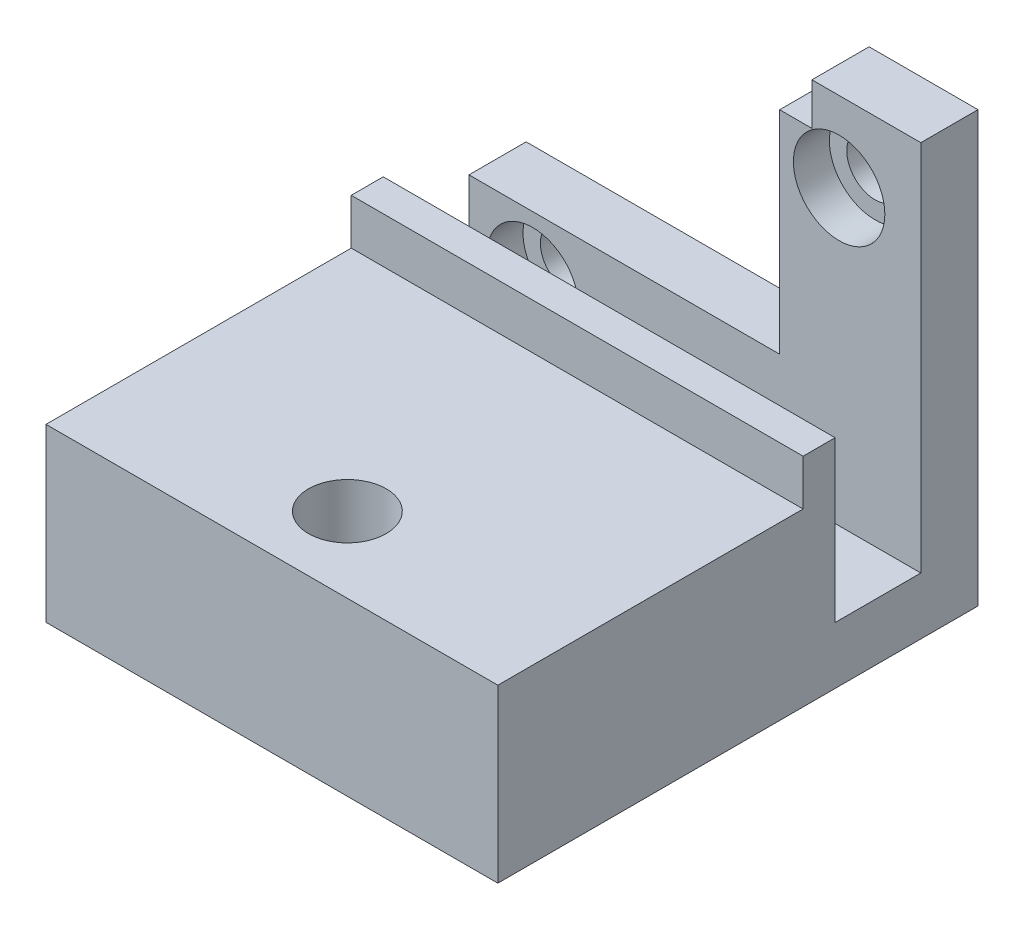
ISO-10303-21;
HEADER;
FILE_DESCRIPTION(('STEP AP214'),'2;1');
FILE_NAME('part.step','',(''),(''),'','','');
FILE_SCHEMA(('AUTOMOTIVE_DESIGN { 1 0 10303 214 1 1 1 1 }'));
ENDSEC;
DATA;
#1=APPLICATION_CONTEXT('core data for automotive mechanical design processes');
#2=APPLICATION_PROTOCOL_DEFINITION('international standard','automotive_design',2000,#1);
#3=PRODUCT_CONTEXT('',#1,'mechanical');
#4=PRODUCT('Part','Part','',(#3));
#5=PRODUCT_RELATED_PRODUCT_CATEGORY('part','',(#4));
#6=PRODUCT_DEFINITION_FORMATION('','',#4);
#7=PRODUCT_DEFINITION_CONTEXT('part definition',#1,'design');
#8=PRODUCT_DEFINITION('design','',#6,#7);
#9=PRODUCT_DEFINITION_SHAPE('','',#8);
#10=(LENGTH_UNIT() NAMED_UNIT(*) SI_UNIT(.MILLI.,.METRE.));
#11=(NAMED_UNIT(*) PLANE_ANGLE_UNIT() SI_UNIT($,.RADIAN.));
#12=(NAMED_UNIT(*) SI_UNIT($,.STERADIAN.) SOLID_ANGLE_UNIT());
#13=UNCERTAINTY_MEASURE_WITH_UNIT(LENGTH_MEASURE(1.E-05),#10,'distance_accuracy_value','');
#14=(GEOMETRIC_REPRESENTATION_CONTEXT(3) GLOBAL_UNCERTAINTY_ASSIGNED_CONTEXT((#13)) GLOBAL_UNIT_ASSIGNED_CONTEXT((#10,
#11,#12)) REPRESENTATION_CONTEXT('',''));
#15=CARTESIAN_POINT('',(0.,0.,0.));
#16=DIRECTION('',(0.,0.,1.));
#17=DIRECTION('',(1.,0.,0.));
#18=AXIS2_PLACEMENT_3D('',#15,#16,#17);
#19=CARTESIAN_POINT('',(0.,-1.69240490381664,0.));
#20=DIRECTION('',(0.,-1.,0.));
#21=DIRECTION('',(0.,0.,-1.));
#22=AXIS2_PLACEMENT_3D('',#19,#20,#21);
#23=PLANE('',#22);
#24=CARTESIAN_POINT('',(-0.311786170994832,-1.69240490381664,22.479));
#25=DIRECTION('',(0.,-1.,0.));
#26=DIRECTION('',(0.,0.,-1.));
#27=AXIS2_PLACEMENT_3D('',#24,#25,#26);
#28=CIRCLE('',#27,2.159);
#29=CARTESIAN_POINT('',(-0.311786170994832,-1.69240490381664,20.32));
#30=VERTEX_POINT('',#29);
#31=EDGE_CURVE('E147',#30,#30,#28,.T.);
#32=ORIENTED_EDGE('',*,*,#31,.T.);
#33=EDGE_LOOP('',(#32));
#34=FACE_BOUND('',#33,.T.);
#35=DIRECTION('',(1.,0.,0.));
#36=VECTOR('',#35,1.);
#37=CARTESIAN_POINT('',(-12.8607861709948,-1.69240490381664,9.7155));
#38=LINE('',#37,#36);
#39=CARTESIAN_POINT('',(-12.8607861709948,-1.69240490381664,9.7155));
#40=VERTEX_POINT('',#39);
#41=CARTESIAN_POINT('',(12.2372138290052,-1.69240490381664,9.7155));
#42=VERTEX_POINT('',#41);
#43=EDGE_CURVE('E164',#40,#42,#38,.T.);
#44=ORIENTED_EDGE('',*,*,#43,.F.);
#45=DIRECTION('',(0.,0.,1.));
#46=VECTOR('',#45,1.);
#47=CARTESIAN_POINT('',(-12.8607861709948,-1.69240490381664,26.67));
#48=LINE('',#47,#46);
#49=CARTESIAN_POINT('',(-12.8607861709948,-1.69240490381664,26.67));
#50=VERTEX_POINT('',#49);
#51=EDGE_CURVE('E268',#40,#50,#48,.T.);
#52=ORIENTED_EDGE('',*,*,#51,.T.);
#53=DIRECTION('',(1.,0.,0.));
#54=VECTOR('',#53,1.);
#55=CARTESIAN_POINT('',(-12.8607861709948,-1.69240490381664,26.67));
#56=LINE('',#55,#54);
#57=CARTESIAN_POINT('',(12.2372138290052,-1.69240490381664,26.67));
#58=VERTEX_POINT('',#57);
#59=EDGE_CURVE('E277',#50,#58,#56,.T.);
#60=ORIENTED_EDGE('',*,*,#59,.T.);
#61=DIRECTION('',(0.,0.,-1.));
#62=VECTOR('',#61,1.);
#63=CARTESIAN_POINT('',(12.2372138290052,-1.69240490381664,26.67));
#64=LINE('',#63,#62);
#65=EDGE_CURVE('E160',#58,#42,#64,.T.);
#66=ORIENTED_EDGE('',*,*,#65,.T.);
#67=EDGE_LOOP('',(#44,#52,#60,#66));
#68=FACE_BOUND('',#67,.T.);
#69=ADVANCED_FACE('F143',(#34,#68),#23,.F.);
#70=CARTESIAN_POINT('',(12.2372138290052,-8.04240490381664,26.67));
#71=DIRECTION('',(0.,1.,0.));
#72=DIRECTION('',(0.,0.,1.));
#73=AXIS2_PLACEMENT_3D('',#70,#71,#72);
#74=PLANE('',#73);
#75=DIRECTION('',(0.,0.,-1.));
#76=VECTOR('',#75,1.);
#77=CARTESIAN_POINT('',(-12.8607861709948,-8.04240490381664,26.67));
#78=LINE('',#77,#76);
#79=CARTESIAN_POINT('',(-12.8607861709948,-8.04240490381664,7.9375));
#80=VERTEX_POINT('',#79);
#81=CARTESIAN_POINT('',(-12.8607861709948,-8.04240490381664,3.175));
#82=VERTEX_POINT('',#81);
#83=EDGE_CURVE('E317',#80,#82,#78,.T.);
#84=ORIENTED_EDGE('',*,*,#83,.F.);
#85=DIRECTION('',(-1.,0.,0.));
#86=VECTOR('',#85,1.);
#87=CARTESIAN_POINT('',(-12.8607861709948,-8.04240490381664,7.9375));
#88=LINE('',#87,#86);
#89=CARTESIAN_POINT('',(12.2372138290052,-8.04240490381664,7.9375));
#90=VERTEX_POINT('',#89);
#91=EDGE_CURVE('E278',#90,#80,#88,.T.);
#92=ORIENTED_EDGE('',*,*,#91,.F.);
#93=DIRECTION('',(0.,0.,-1.));
#94=VECTOR('',#93,1.);
#95=CARTESIAN_POINT('',(12.2372138290052,-8.04240490381664,26.67));
#96=LINE('',#95,#94);
#97=CARTESIAN_POINT('',(12.2372138290052,-8.04240490381664,3.175));
#98=VERTEX_POINT('',#97);
#99=EDGE_CURVE('E314',#90,#98,#96,.T.);
#100=ORIENTED_EDGE('',*,*,#99,.T.);
#101=DIRECTION('',(-1.,0.,0.));
#102=VECTOR('',#101,1.);
#103=CARTESIAN_POINT('',(0.,-8.04240490381664,3.175));
#104=LINE('',#103,#102);
#105=EDGE_CURVE('E152',#98,#82,#104,.T.);
#106=ORIENTED_EDGE('',*,*,#105,.T.);
#107=EDGE_LOOP('',(#84,#92,#100,#106));
#108=FACE_BOUND('',#107,.T.);
#109=ADVANCED_FACE('F417',(#108),#74,.T.);
#110=CARTESIAN_POINT('',(-9.32078617099483,-4.74040490381666,3.175));
#111=DIRECTION('',(0.,0.,-1.));
#112=DIRECTION('',(-1.,0.,0.));
#113=AXIS2_PLACEMENT_3D('',#110,#111,#112);
#114=CYLINDRICAL_SURFACE('',#113,1.5748);
#115=CARTESIAN_POINT('',(-9.32078617099483,-4.74040490381666,0.));
#116=DIRECTION('',(0.,0.,1.));
#117=DIRECTION('',(1.,0.,0.));
#118=AXIS2_PLACEMENT_3D('',#115,#116,#117);
#119=CIRCLE('',#118,1.5748);
#120=CARTESIAN_POINT('',(-7.74598617099483,-4.74040490381666,0.));
#121=VERTEX_POINT('',#120);
#122=EDGE_CURVE('E316',#121,#121,#119,.T.);
#123=ORIENTED_EDGE('',*,*,#122,.F.);
#124=EDGE_LOOP('',(#123));
#125=FACE_BOUND('',#124,.T.);
#126=CARTESIAN_POINT('',(-9.32078617099483,-4.74040490381666,1.175));
#127=DIRECTION('',(0.,0.,1.));
#128=DIRECTION('',(1.,0.,0.));
#129=AXIS2_PLACEMENT_3D('',#126,#127,#128);
#130=CIRCLE('',#129,1.5748);
#131=CARTESIAN_POINT('',(-7.74598617099483,-4.74040490381666,1.175));
#132=VERTEX_POINT('',#131);
#133=EDGE_CURVE('E313',#132,#132,#130,.T.);
#134=ORIENTED_EDGE('',*,*,#133,.T.);
#135=EDGE_LOOP('',(#134));
#136=FACE_BOUND('',#135,.T.);
#137=ADVANCED_FACE('F387',(#125,#136),#114,.F.);
#138=CARTESIAN_POINT('',(7.69721382900516,8.21359509618334,3.175));
#139=DIRECTION('',(0.,0.,-1.));
#140=DIRECTION('',(-1.,0.,0.));
#141=AXIS2_PLACEMENT_3D('',#138,#139,#140);
#142=CYLINDRICAL_SURFACE('',#141,1.5748);
#143=CARTESIAN_POINT('',(7.69721382900516,8.21359509618334,0.));
#144=DIRECTION('',(0.,0.,1.));
#145=DIRECTION('',(1.,0.,0.));
#146=AXIS2_PLACEMENT_3D('',#143,#144,#145);
#147=CIRCLE('',#146,1.5748);
#148=CARTESIAN_POINT('',(9.27201382900516,8.21359509618334,0.));
#149=VERTEX_POINT('',#148);
#150=EDGE_CURVE('E340',#149,#149,#147,.T.);
#151=ORIENTED_EDGE('',*,*,#150,.F.);
#152=EDGE_LOOP('',(#151));
#153=FACE_BOUND('',#152,.T.);
#154=CARTESIAN_POINT('',(7.69721382900516,8.21359509618334,1.175));
#155=DIRECTION('',(0.,0.,1.));
#156=DIRECTION('',(1.,0.,0.));
#157=AXIS2_PLACEMENT_3D('',#154,#155,#156);
#158=CIRCLE('',#157,1.5748);
#159=CARTESIAN_POINT('',(9.27201382900516,8.21359509618334,1.175));
#160=VERTEX_POINT('',#159);
#161=EDGE_CURVE('E292',#160,#160,#158,.T.);
#162=ORIENTED_EDGE('',*,*,#161,.T.);
#163=EDGE_LOOP('',(#162));
#164=FACE_BOUND('',#163,.T.);
#165=ADVANCED_FACE('F487',(#153,#164),#142,.F.);
#166=CARTESIAN_POINT('',(0.,-1.43840490381666,3.175));
#167=DIRECTION('',(0.,-1.,0.));
#168=DIRECTION('',(1.,0.,0.));
#169=AXIS2_PLACEMENT_3D('',#166,#167,#168);
#170=PLANE('',#169);
#171=DIRECTION('',(-1.,0.,0.));
#172=VECTOR('',#171,1.);
#173=CARTESIAN_POINT('',(0.,-1.43840490381666,0.));
#174=LINE('',#173,#172);
#175=CARTESIAN_POINT('',(4.39521382900517,-1.43840490381666,0.));
#176=VERTEX_POINT('',#175);
#177=CARTESIAN_POINT('',(-12.8607861709948,-1.43840490381666,0.));
#178=VERTEX_POINT('',#177);
#179=EDGE_CURVE('E333',#176,#178,#174,.T.);
#180=ORIENTED_EDGE('',*,*,#179,.T.);
#181=DIRECTION('',(0.,0.,-1.));
#182=VECTOR('',#181,1.);
#183=CARTESIAN_POINT('',(-12.8607861709948,-1.43840490381666,3.175));
#184=LINE('',#183,#182);
#185=CARTESIAN_POINT('',(-12.8607861709948,-1.43840490381666,3.175));
#186=VERTEX_POINT('',#185);
#187=EDGE_CURVE('E12',#186,#178,#184,.T.);
#188=ORIENTED_EDGE('',*,*,#187,.F.);
#189=DIRECTION('',(-1.,0.,0.));
#190=VECTOR('',#189,1.);
#191=CARTESIAN_POINT('',(0.,-1.43840490381666,3.175));
#192=LINE('',#191,#190);
#193=CARTESIAN_POINT('',(4.39521382900517,-1.43840490381666,3.175));
#194=VERTEX_POINT('',#193);
#195=EDGE_CURVE('E324',#194,#186,#192,.T.);
#196=ORIENTED_EDGE('',*,*,#195,.F.);
#197=DIRECTION('',(0.,0.,-1.));
#198=VECTOR('',#197,1.);
#199=CARTESIAN_POINT('',(4.39521382900517,-1.43840490381666,3.175));
#200=LINE('',#199,#198);
#201=EDGE_CURVE('E358',#194,#176,#200,.T.);
#202=ORIENTED_EDGE('',*,*,#201,.T.);
#203=EDGE_LOOP('',(#180,#188,#196,#202));
#204=FACE_BOUND('',#203,.T.);
#205=ADVANCED_FACE('F415',(#204),#170,.F.);
#206=CARTESIAN_POINT('',(-12.8607861709948,0.,3.175));
#207=DIRECTION('',(1.,0.,0.));
#208=DIRECTION('',(0.,0.,-1.));
#209=AXIS2_PLACEMENT_3D('',#206,#207,#208);
#210=PLANE('',#209);
#211=DIRECTION('',(0.,-1.,0.));
#212=VECTOR('',#211,1.);
#213=CARTESIAN_POINT('',(-12.8607861709948,0.,0.));
#214=LINE('',#213,#212);
#215=CARTESIAN_POINT('',(-12.8607861709948,-11.2174049038166,0.));
#216=VERTEX_POINT('',#215);
#217=EDGE_CURVE('E328',#178,#216,#214,.T.);
#218=ORIENTED_EDGE('',*,*,#217,.T.);
#219=DIRECTION('',(0.,0.,-1.));
#220=VECTOR('',#219,1.);
#221=CARTESIAN_POINT('',(-12.8607861709948,-11.2174049038166,26.67));
#222=LINE('',#221,#220);
#223=CARTESIAN_POINT('',(-12.8607861709948,-11.2174049038166,26.67));
#224=VERTEX_POINT('',#223);
#225=EDGE_CURVE('E319',#224,#216,#222,.T.);
#226=ORIENTED_EDGE('',*,*,#225,.F.);
#227=DIRECTION('',(0.,1.,0.));
#228=VECTOR('',#227,1.);
#229=CARTESIAN_POINT('',(-12.8607861709948,-8.04240490381664,26.67));
#230=LINE('',#229,#228);
#231=EDGE_CURVE('E308',#224,#50,#230,.T.);
#232=ORIENTED_EDGE('',*,*,#231,.T.);
#233=ORIENTED_EDGE('',*,*,#51,.F.);
#234=DIRECTION('',(0.,-1.,0.));
#235=VECTOR('',#234,1.);
#236=CARTESIAN_POINT('',(-12.8607861709948,0.847595096183364,9.7155));
#237=LINE('',#236,#235);
#238=CARTESIAN_POINT('',(-12.8607861709948,0.847595096183364,9.7155));
#239=VERTEX_POINT('',#238);
#240=EDGE_CURVE('E249',#239,#40,#237,.T.);
#241=ORIENTED_EDGE('',*,*,#240,.F.);
#242=DIRECTION('',(0.,0.,1.));
#243=VECTOR('',#242,1.);
#244=CARTESIAN_POINT('',(-12.8607861709948,0.847595096183364,7.9375));
#245=LINE('',#244,#243);
#246=CARTESIAN_POINT('',(-12.8607861709948,0.847595096183364,7.9375));
#247=VERTEX_POINT('',#246);
#248=EDGE_CURVE('E256',#247,#239,#245,.T.);
#249=ORIENTED_EDGE('',*,*,#248,.F.);
#250=DIRECTION('',(0.,-1.,0.));
#251=VECTOR('',#250,1.);
#252=CARTESIAN_POINT('',(-12.8607861709948,-1.69240490381664,7.9375));
#253=LINE('',#252,#251);
#254=EDGE_CURVE('E281',#247,#80,#253,.T.);
#255=ORIENTED_EDGE('',*,*,#254,.T.);
#256=ORIENTED_EDGE('',*,*,#83,.T.);
#257=DIRECTION('',(0.,-1.,0.));
#258=VECTOR('',#257,1.);
#259=CARTESIAN_POINT('',(-12.8607861709948,0.,3.175));
#260=LINE('',#259,#258);
#261=EDGE_CURVE('E327',#186,#82,#260,.T.);
#262=ORIENTED_EDGE('',*,*,#261,.F.);
#263=ORIENTED_EDGE('',*,*,#187,.T.);
#264=EDGE_LOOP('',(#218,#226,#232,#233,#241,#249,#255,#256,#262,#263));
#265=FACE_BOUND('',#264,.T.);
#266=ADVANCED_FACE('F266',(#265),#210,.F.);
#267=CARTESIAN_POINT('',(0.,0.,3.175));
#268=DIRECTION('',(0.,0.,1.));
#269=DIRECTION('',(1.,0.,0.));
#270=AXIS2_PLACEMENT_3D('',#267,#268,#269);
#271=PLANE('',#270);
#272=CARTESIAN_POINT('',(7.69721382900516,8.21359509618334,3.175));
#273=DIRECTION('',(0.,0.,1.));
#274=DIRECTION('',(1.,0.,0.));
#275=AXIS2_PLACEMENT_3D('',#272,#273,#274);
#276=CIRCLE('',#275,2.54);
#277=CARTESIAN_POINT('',(10.2372138290052,8.21359509618334,3.175));
#278=VERTEX_POINT('',#277);
#279=EDGE_CURVE('E293',#278,#278,#276,.T.);
#280=ORIENTED_EDGE('',*,*,#279,.F.);
#281=EDGE_LOOP('',(#280));
#282=FACE_BOUND('',#281,.T.);
#283=CARTESIAN_POINT('',(-9.32078617099483,-4.74040490381666,3.175));
#284=DIRECTION('',(0.,0.,1.));
#285=DIRECTION('',(1.,0.,0.));
#286=AXIS2_PLACEMENT_3D('',#283,#284,#285);
#287=CIRCLE('',#286,2.54);
#288=CARTESIAN_POINT('',(-6.78078617099483,-4.74040490381666,3.175));
#289=VERTEX_POINT('',#288);
#290=EDGE_CURVE('E288',#289,#289,#287,.T.);
#291=ORIENTED_EDGE('',*,*,#290,.F.);
#292=EDGE_LOOP('',(#291));
#293=FACE_BOUND('',#292,.T.);
#294=ORIENTED_EDGE('',*,*,#195,.T.);
#295=ORIENTED_EDGE('',*,*,#261,.T.);
#296=ORIENTED_EDGE('',*,*,#105,.F.);
#297=DIRECTION('',(0.,1.,0.));
#298=VECTOR('',#297,1.);
#299=CARTESIAN_POINT('',(12.2372138290052,-8.04240490381664,3.175));
#300=LINE('',#299,#298);
#301=CARTESIAN_POINT('',(12.2372138290052,12.6585950961833,3.175));
#302=VERTEX_POINT('',#301);
#303=EDGE_CURVE('E344',#98,#302,#300,.T.);
#304=ORIENTED_EDGE('',*,*,#303,.T.);
#305=DIRECTION('',(-1.,0.,0.));
#306=VECTOR('',#305,1.);
#307=CARTESIAN_POINT('',(12.2372138290052,12.6585950961833,3.175));
#308=LINE('',#307,#306);
#309=CARTESIAN_POINT('',(6.18817038186677,12.6585950961833,3.175));
#310=VERTEX_POINT('',#309);
#311=EDGE_CURVE('E346',#302,#310,#308,.T.);
#312=ORIENTED_EDGE('',*,*,#311,.T.);
#313=DIRECTION('',(0.,1.,0.));
#314=VECTOR('',#313,1.);
#315=CARTESIAN_POINT('',(6.18817038186677,10.3218119533511,3.175));
#316=LINE('',#315,#314);
#317=CARTESIAN_POINT('',(6.18817038186677,10.3218119533511,3.175));
#318=VERTEX_POINT('',#317);
#319=EDGE_CURVE('E349',#318,#310,#316,.T.);
#320=ORIENTED_EDGE('',*,*,#319,.F.);
#321=DIRECTION('',(1.,0.,0.));
#322=VECTOR('',#321,1.);
#323=CARTESIAN_POINT('',(4.39521382900517,10.3218119533511,3.175));
#324=LINE('',#323,#322);
#325=CARTESIAN_POINT('',(4.39521382900517,10.3218119533511,3.175));
#326=VERTEX_POINT('',#325);
#327=EDGE_CURVE('E352',#326,#318,#324,.T.);
#328=ORIENTED_EDGE('',*,*,#327,.F.);
#329=DIRECTION('',(0.,-1.,0.));
#330=VECTOR('',#329,1.);
#331=CARTESIAN_POINT('',(4.39521382900517,10.3218119533511,3.175));
#332=LINE('',#331,#330);
#333=EDGE_CURVE('E355',#326,#194,#332,.T.);
#334=ORIENTED_EDGE('',*,*,#333,.T.);
#335=EDGE_LOOP('',(#294,#295,#296,#304,#312,#320,#328,#334));
#336=FACE_BOUND('',#335,.T.);
#337=ADVANCED_FACE('F403',(#282,#293,#336),#271,.T.);
#338=CARTESIAN_POINT('',(0.,0.,0.));
#339=DIRECTION('',(0.,0.,1.));
#340=DIRECTION('',(1.,0.,0.));
#341=AXIS2_PLACEMENT_3D('',#338,#339,#340);
#342=PLANE('',#341);
#343=ORIENTED_EDGE('',*,*,#179,.F.);
#344=DIRECTION('',(0.,-1.,0.));
#345=VECTOR('',#344,1.);
#346=CARTESIAN_POINT('',(4.39521382900517,7.82738812093123,0.));
#347=LINE('',#346,#345);
#348=CARTESIAN_POINT('',(4.39521382900517,10.3218119533511,0.));
#349=VERTEX_POINT('',#348);
#350=EDGE_CURVE('E347',#349,#176,#347,.T.);
#351=ORIENTED_EDGE('',*,*,#350,.F.);
#352=DIRECTION('',(1.,0.,0.));
#353=VECTOR('',#352,1.);
#354=CARTESIAN_POINT('',(4.39521382900517,10.3218119533511,0.));
#355=LINE('',#354,#353);
#356=CARTESIAN_POINT('',(6.18817038186677,10.3218119533511,0.));
#357=VERTEX_POINT('',#356);
#358=EDGE_CURVE('E367',#349,#357,#355,.T.);
#359=ORIENTED_EDGE('',*,*,#358,.T.);
#360=DIRECTION('',(0.,1.,0.));
#361=VECTOR('',#360,1.);
#362=CARTESIAN_POINT('',(6.18817038186677,10.3218119533511,0.));
#363=LINE('',#362,#361);
#364=CARTESIAN_POINT('',(6.18817038186677,12.6585950961833,0.));
#365=VERTEX_POINT('',#364);
#366=EDGE_CURVE('E364',#357,#365,#363,.T.);
#367=ORIENTED_EDGE('',*,*,#366,.T.);
#368=DIRECTION('',(-1.,0.,0.));
#369=VECTOR('',#368,1.);
#370=CARTESIAN_POINT('',(7.69721382900516,12.6585950961833,0.));
#371=LINE('',#370,#369);
#372=CARTESIAN_POINT('',(12.2372138290052,12.6585950961833,0.));
#373=VERTEX_POINT('',#372);
#374=EDGE_CURVE('E361',#373,#365,#371,.T.);
#375=ORIENTED_EDGE('',*,*,#374,.F.);
#376=DIRECTION('',(0.,1.,0.));
#377=VECTOR('',#376,1.);
#378=CARTESIAN_POINT('',(12.2372138290052,-8.04240490381664,0.));
#379=LINE('',#378,#377);
#380=CARTESIAN_POINT('',(12.2372138290052,-11.2174049038166,0.));
#381=VERTEX_POINT('',#380);
#382=EDGE_CURVE('E343',#381,#373,#379,.T.);
#383=ORIENTED_EDGE('',*,*,#382,.F.);
#384=DIRECTION('',(-1.,0.,0.));
#385=VECTOR('',#384,1.);
#386=CARTESIAN_POINT('',(12.2372138290052,-11.2174049038166,0.));
#387=LINE('',#386,#385);
#388=EDGE_CURVE('E305',#381,#216,#387,.T.);
#389=ORIENTED_EDGE('',*,*,#388,.T.);
#390=ORIENTED_EDGE('',*,*,#217,.F.);
#391=EDGE_LOOP('',(#343,#351,#359,#367,#375,#383,#389,#390));
#392=FACE_BOUND('',#391,.T.);
#393=ORIENTED_EDGE('',*,*,#150,.T.);
#394=EDGE_LOOP('',(#393));
#395=FACE_BOUND('',#394,.T.);
#396=ORIENTED_EDGE('',*,*,#122,.T.);
#397=EDGE_LOOP('',(#396));
#398=FACE_BOUND('',#397,.T.);
#399=ADVANCED_FACE('F406',(#392,#395,#398),#342,.F.);
#400=CARTESIAN_POINT('',(4.39521382900517,7.82738812093123,3.175));
#401=DIRECTION('',(1.,0.,0.));
#402=DIRECTION('',(0.,0.,-1.));
#403=AXIS2_PLACEMENT_3D('',#400,#401,#402);
#404=PLANE('',#403);
#405=ORIENTED_EDGE('',*,*,#350,.T.);
#406=ORIENTED_EDGE('',*,*,#201,.F.);
#407=ORIENTED_EDGE('',*,*,#333,.F.);
#408=DIRECTION('',(0.,0.,-1.));
#409=VECTOR('',#408,1.);
#410=CARTESIAN_POINT('',(4.39521382900517,10.3218119533511,3.175));
#411=LINE('',#410,#409);
#412=EDGE_CURVE('E374',#326,#349,#411,.T.);
#413=ORIENTED_EDGE('',*,*,#412,.T.);
#414=EDGE_LOOP('',(#405,#406,#407,#413));
#415=FACE_BOUND('',#414,.T.);
#416=ADVANCED_FACE('F446',(#415),#404,.F.);
#417=CARTESIAN_POINT('',(4.39521382900517,10.3218119533511,3.175));
#418=DIRECTION('',(0.,1.,0.));
#419=DIRECTION('',(0.,0.,1.));
#420=AXIS2_PLACEMENT_3D('',#417,#418,#419);
#421=PLANE('',#420);
#422=ORIENTED_EDGE('',*,*,#358,.F.);
#423=ORIENTED_EDGE('',*,*,#412,.F.);
#424=ORIENTED_EDGE('',*,*,#327,.T.);
#425=DIRECTION('',(0.,0.,-1.));
#426=VECTOR('',#425,1.);
#427=CARTESIAN_POINT('',(6.18817038186677,10.3218119533511,3.175));
#428=LINE('',#427,#426);
#429=EDGE_CURVE('E377',#318,#357,#428,.T.);
#430=ORIENTED_EDGE('',*,*,#429,.T.);
#431=EDGE_LOOP('',(#422,#423,#424,#430));
#432=FACE_BOUND('',#431,.T.);
#433=ADVANCED_FACE('F443',(#432),#421,.T.);
#434=CARTESIAN_POINT('',(6.18817038186677,10.3218119533511,3.175));
#435=DIRECTION('',(-1.,0.,0.));
#436=DIRECTION('',(0.,0.,1.));
#437=AXIS2_PLACEMENT_3D('',#434,#435,#436);
#438=PLANE('',#437);
#439=ORIENTED_EDGE('',*,*,#366,.F.);
#440=ORIENTED_EDGE('',*,*,#429,.F.);
#441=ORIENTED_EDGE('',*,*,#319,.T.);
#442=DIRECTION('',(0.,0.,-1.));
#443=VECTOR('',#442,1.);
#444=CARTESIAN_POINT('',(6.18817038186677,12.6585950961833,3.175));
#445=LINE('',#444,#443);
#446=EDGE_CURVE('E379',#310,#365,#445,.T.);
#447=ORIENTED_EDGE('',*,*,#446,.T.);
#448=EDGE_LOOP('',(#439,#440,#441,#447));
#449=FACE_BOUND('',#448,.T.);
#450=ADVANCED_FACE('F447',(#449),#438,.T.);
#451=CARTESIAN_POINT('',(7.69721382900516,12.6585950961833,3.175));
#452=DIRECTION('',(0.,-1.,0.));
#453=DIRECTION('',(1.,0.,0.));
#454=AXIS2_PLACEMENT_3D('',#451,#452,#453);
#455=PLANE('',#454);
#456=ORIENTED_EDGE('',*,*,#374,.T.);
#457=ORIENTED_EDGE('',*,*,#446,.F.);
#458=ORIENTED_EDGE('',*,*,#311,.F.);
#459=DIRECTION('',(0.,0.,-1.));
#460=VECTOR('',#459,1.);
#461=CARTESIAN_POINT('',(12.2372138290052,12.6585950961833,3.175));
#462=LINE('',#461,#460);
#463=EDGE_CURVE('E336',#302,#373,#462,.T.);
#464=ORIENTED_EDGE('',*,*,#463,.T.);
#465=EDGE_LOOP('',(#456,#457,#458,#464));
#466=FACE_BOUND('',#465,.T.);
#467=ADVANCED_FACE('F437',(#466),#455,.F.);
#468=CARTESIAN_POINT('',(12.2372138290052,-8.04240490381664,3.175));
#469=DIRECTION('',(-1.,0.,0.));
#470=DIRECTION('',(0.,0.,1.));
#471=AXIS2_PLACEMENT_3D('',#468,#469,#470);
#472=PLANE('',#471);
#473=ORIENTED_EDGE('',*,*,#382,.T.);
#474=ORIENTED_EDGE('',*,*,#463,.F.);
#475=ORIENTED_EDGE('',*,*,#303,.F.);
#476=ORIENTED_EDGE('',*,*,#99,.F.);
#477=DIRECTION('',(0.,-1.,0.));
#478=VECTOR('',#477,1.);
#479=CARTESIAN_POINT('',(12.2372138290052,-1.69240490381664,7.9375));
#480=LINE('',#479,#478);
#481=CARTESIAN_POINT('',(12.2372138290052,0.847595096183364,7.9375));
#482=VERTEX_POINT('',#481);
#483=EDGE_CURVE('E285',#482,#90,#480,.T.);
#484=ORIENTED_EDGE('',*,*,#483,.F.);
#485=DIRECTION('',(0.,0.,-1.));
#486=VECTOR('',#485,1.);
#487=CARTESIAN_POINT('',(12.2372138290052,0.847595096183364,7.9375));
#488=LINE('',#487,#486);
#489=CARTESIAN_POINT('',(12.2372138290052,0.847595096183364,9.7155));
#490=VERTEX_POINT('',#489);
#491=EDGE_CURVE('E255',#490,#482,#488,.T.);
#492=ORIENTED_EDGE('',*,*,#491,.F.);
#493=DIRECTION('',(0.,-1.,0.));
#494=VECTOR('',#493,1.);
#495=CARTESIAN_POINT('',(12.2372138290052,0.847595096183364,9.7155));
#496=LINE('',#495,#494);
#497=EDGE_CURVE('E251',#490,#42,#496,.T.);
#498=ORIENTED_EDGE('',*,*,#497,.T.);
#499=ORIENTED_EDGE('',*,*,#65,.F.);
#500=DIRECTION('',(0.,-1.,0.));
#501=VECTOR('',#500,1.);
#502=CARTESIAN_POINT('',(12.2372138290052,-8.04240490381664,26.67));
#503=LINE('',#502,#501);
#504=CARTESIAN_POINT('',(12.2372138290052,-11.2174049038166,26.67));
#505=VERTEX_POINT('',#504);
#506=EDGE_CURVE('E301',#58,#505,#503,.T.);
#507=ORIENTED_EDGE('',*,*,#506,.T.);
#508=DIRECTION('',(0.,0.,-1.));
#509=VECTOR('',#508,1.);
#510=CARTESIAN_POINT('',(12.2372138290052,-11.2174049038166,26.67));
#511=LINE('',#510,#509);
#512=EDGE_CURVE('E310',#505,#381,#511,.T.);
#513=ORIENTED_EDGE('',*,*,#512,.T.);
#514=EDGE_LOOP('',(#473,#474,#475,#476,#484,#492,#498,#499,#507,#513));
#515=FACE_BOUND('',#514,.T.);
#516=ADVANCED_FACE('F145',(#515),#472,.F.);
#517=CARTESIAN_POINT('',(12.2372138290052,-11.2174049038166,26.67));
#518=DIRECTION('',(0.,-1.,0.));
#519=DIRECTION('',(0.,0.,-1.));
#520=AXIS2_PLACEMENT_3D('',#517,#518,#519);
#521=PLANE('',#520);
#522=CARTESIAN_POINT('',(-0.311786170994832,-11.2174049038166,22.479));
#523=DIRECTION('',(0.,-1.,0.));
#524=DIRECTION('',(0.,0.,-1.));
#525=AXIS2_PLACEMENT_3D('',#522,#523,#524);
#526=CIRCLE('',#525,2.159);
#527=CARTESIAN_POINT('',(-0.311786170994832,-11.2174049038166,20.32));
#528=VERTEX_POINT('',#527);
#529=EDGE_CURVE('E269',#528,#528,#526,.T.);
#530=ORIENTED_EDGE('',*,*,#529,.F.);
#531=EDGE_LOOP('',(#530));
#532=FACE_BOUND('',#531,.T.);
#533=ORIENTED_EDGE('',*,*,#388,.F.);
#534=ORIENTED_EDGE('',*,*,#512,.F.);
#535=DIRECTION('',(-1.,0.,0.));
#536=VECTOR('',#535,1.);
#537=CARTESIAN_POINT('',(12.2372138290052,-11.2174049038166,26.67));
#538=LINE('',#537,#536);
#539=EDGE_CURVE('E304',#505,#224,#538,.T.);
#540=ORIENTED_EDGE('',*,*,#539,.T.);
#541=ORIENTED_EDGE('',*,*,#225,.T.);
#542=EDGE_LOOP('',(#533,#534,#540,#541));
#543=FACE_BOUND('',#542,.T.);
#544=ADVANCED_FACE('F431',(#532,#543),#521,.T.);
#545=CARTESIAN_POINT('',(0.,0.,26.67));
#546=DIRECTION('',(0.,0.,-1.));
#547=DIRECTION('',(-1.,0.,0.));
#548=AXIS2_PLACEMENT_3D('',#545,#546,#547);
#549=PLANE('',#548);
#550=ORIENTED_EDGE('',*,*,#506,.F.);
#551=ORIENTED_EDGE('',*,*,#59,.F.);
#552=ORIENTED_EDGE('',*,*,#231,.F.);
#553=ORIENTED_EDGE('',*,*,#539,.F.);
#554=EDGE_LOOP('',(#550,#551,#552,#553));
#555=FACE_BOUND('',#554,.T.);
#556=ADVANCED_FACE('F428',(#555),#549,.F.);
#557=CARTESIAN_POINT('',(7.69721382900516,8.21359509618334,1.175));
#558=DIRECTION('',(0.,0.,1.));
#559=DIRECTION('',(1.,0.,0.));
#560=AXIS2_PLACEMENT_3D('',#557,#558,#559);
#561=CYLINDRICAL_SURFACE('',#560,2.54);
#562=CARTESIAN_POINT('',(7.69721382900516,8.21359509618334,1.175));
#563=DIRECTION('',(0.,0.,1.));
#564=DIRECTION('',(1.,0.,0.));
#565=AXIS2_PLACEMENT_3D('',#562,#563,#564);
#566=CIRCLE('',#565,2.54);
#567=CARTESIAN_POINT('',(10.2372138290052,8.21359509618334,1.175));
#568=VERTEX_POINT('',#567);
#569=EDGE_CURVE('E289',#568,#568,#566,.T.);
#570=ORIENTED_EDGE('',*,*,#569,.F.);
#571=EDGE_LOOP('',(#570));
#572=FACE_BOUND('',#571,.T.);
#573=ORIENTED_EDGE('',*,*,#279,.T.);
#574=EDGE_LOOP('',(#573));
#575=FACE_BOUND('',#574,.T.);
#576=ADVANCED_FACE('F471',(#572,#575),#561,.F.);
#577=CARTESIAN_POINT('',(7.69721382900516,8.21359509618334,1.175));
#578=DIRECTION('',(0.,0.,1.));
#579=DIRECTION('',(1.,0.,0.));
#580=AXIS2_PLACEMENT_3D('',#577,#578,#579);
#581=PLANE('',#580);
#582=ORIENTED_EDGE('',*,*,#161,.F.);
#583=EDGE_LOOP('',(#582));
#584=FACE_BOUND('',#583,.T.);
#585=ORIENTED_EDGE('',*,*,#569,.T.);
#586=EDGE_LOOP('',(#585));
#587=FACE_BOUND('',#586,.T.);
#588=ADVANCED_FACE('F399',(#584,#587),#581,.T.);
#589=CARTESIAN_POINT('',(-9.32078617099483,-4.74040490381666,1.175));
#590=DIRECTION('',(0.,0.,1.));
#591=DIRECTION('',(1.,0.,0.));
#592=AXIS2_PLACEMENT_3D('',#589,#590,#591);
#593=CYLINDRICAL_SURFACE('',#592,2.54);
#594=CARTESIAN_POINT('',(-9.32078617099483,-4.74040490381666,1.175));
#595=DIRECTION('',(0.,0.,1.));
#596=DIRECTION('',(1.,0.,0.));
#597=AXIS2_PLACEMENT_3D('',#594,#595,#596);
#598=CIRCLE('',#597,2.54);
#599=CARTESIAN_POINT('',(-6.78078617099483,-4.74040490381666,1.175));
#600=VERTEX_POINT('',#599);
#601=EDGE_CURVE('E296',#600,#600,#598,.T.);
#602=ORIENTED_EDGE('',*,*,#601,.F.);
#603=EDGE_LOOP('',(#602));
#604=FACE_BOUND('',#603,.T.);
#605=ORIENTED_EDGE('',*,*,#290,.T.);
#606=EDGE_LOOP('',(#605));
#607=FACE_BOUND('',#606,.T.);
#608=ADVANCED_FACE('F393',(#604,#607),#593,.F.);
#609=CARTESIAN_POINT('',(-9.32078617099483,-4.74040490381666,1.175));
#610=DIRECTION('',(0.,0.,1.));
#611=DIRECTION('',(1.,0.,0.));
#612=AXIS2_PLACEMENT_3D('',#609,#610,#611);
#613=PLANE('',#612);
#614=ORIENTED_EDGE('',*,*,#133,.F.);
#615=EDGE_LOOP('',(#614));
#616=FACE_BOUND('',#615,.T.);
#617=ORIENTED_EDGE('',*,*,#601,.T.);
#618=EDGE_LOOP('',(#617));
#619=FACE_BOUND('',#618,.T.);
#620=ADVANCED_FACE('F389',(#616,#619),#613,.T.);
#621=CARTESIAN_POINT('',(-12.8607861709948,-1.69240490381664,7.9375));
#622=DIRECTION('',(0.,0.,1.));
#623=DIRECTION('',(1.,0.,0.));
#624=AXIS2_PLACEMENT_3D('',#621,#622,#623);
#625=PLANE('',#624);
#626=ORIENTED_EDGE('',*,*,#91,.T.);
#627=ORIENTED_EDGE('',*,*,#254,.F.);
#628=DIRECTION('',(-1.,0.,0.));
#629=VECTOR('',#628,1.);
#630=CARTESIAN_POINT('',(-12.8607861709948,0.847595096183364,7.9375));
#631=LINE('',#630,#629);
#632=EDGE_CURVE('E262',#482,#247,#631,.T.);
#633=ORIENTED_EDGE('',*,*,#632,.F.);
#634=ORIENTED_EDGE('',*,*,#483,.T.);
#635=EDGE_LOOP('',(#626,#627,#633,#634));
#636=FACE_BOUND('',#635,.T.);
#637=ADVANCED_FACE('F392',(#636),#625,.F.);
#638=CARTESIAN_POINT('',(-0.311786170994832,12.6585950961833,22.479));
#639=DIRECTION('',(0.,-1.,0.));
#640=DIRECTION('',(0.,0.,-1.));
#641=AXIS2_PLACEMENT_3D('',#638,#639,#640);
#642=CYLINDRICAL_SURFACE('',#641,2.159);
#643=ORIENTED_EDGE('',*,*,#529,.T.);
#644=EDGE_LOOP('',(#643));
#645=FACE_BOUND('',#644,.T.);
#646=ORIENTED_EDGE('',*,*,#31,.F.);
#647=EDGE_LOOP('',(#646));
#648=FACE_BOUND('',#647,.T.);
#649=ADVANCED_FACE('F465',(#645,#648),#642,.F.);
#650=CARTESIAN_POINT('',(-12.8607861709948,0.847595096183364,9.7155));
#651=DIRECTION('',(0.,0.,-1.));
#652=DIRECTION('',(-1.,0.,0.));
#653=AXIS2_PLACEMENT_3D('',#650,#651,#652);
#654=PLANE('',#653);
#655=ORIENTED_EDGE('',*,*,#43,.T.);
#656=ORIENTED_EDGE('',*,*,#497,.F.);
#657=DIRECTION('',(1.,0.,0.));
#658=VECTOR('',#657,1.);
#659=CARTESIAN_POINT('',(-12.8607861709948,0.847595096183364,9.7155));
#660=LINE('',#659,#658);
#661=EDGE_CURVE('E245',#239,#490,#660,.T.);
#662=ORIENTED_EDGE('',*,*,#661,.F.);
#663=ORIENTED_EDGE('',*,*,#240,.T.);
#664=EDGE_LOOP('',(#655,#656,#662,#663));
#665=FACE_BOUND('',#664,.T.);
#666=ADVANCED_FACE('F247',(#665),#654,.F.);
#667=CARTESIAN_POINT('',(0.,0.847595096183364,0.));
#668=DIRECTION('',(0.,1.,0.));
#669=DIRECTION('',(0.,0.,1.));
#670=AXIS2_PLACEMENT_3D('',#667,#668,#669);
#671=PLANE('',#670);
#672=ORIENTED_EDGE('',*,*,#248,.T.);
#673=ORIENTED_EDGE('',*,*,#661,.T.);
#674=ORIENTED_EDGE('',*,*,#491,.T.);
#675=ORIENTED_EDGE('',*,*,#632,.T.);
#676=EDGE_LOOP('',(#672,#673,#674,#675));
#677=FACE_BOUND('',#676,.T.);
#678=ADVANCED_FACE('F260',(#677),#671,.T.);
#679=CLOSED_SHELL('',(#69,#109,#137,#165,#205,#266,#337,#399,#416,#433,#450,#467,#516,#544,#556,
#576,#588,#608,#620,#637,#649,#666,#678));
#680=MANIFOLD_SOLID_BREP('B2',#679);
#681=ADVANCED_BREP_SHAPE_REPRESENTATION('',(#18,#680),#14);
#682=SHAPE_DEFINITION_REPRESENTATION(#9,#681);
ENDSEC;
END-ISO-10303-21;
